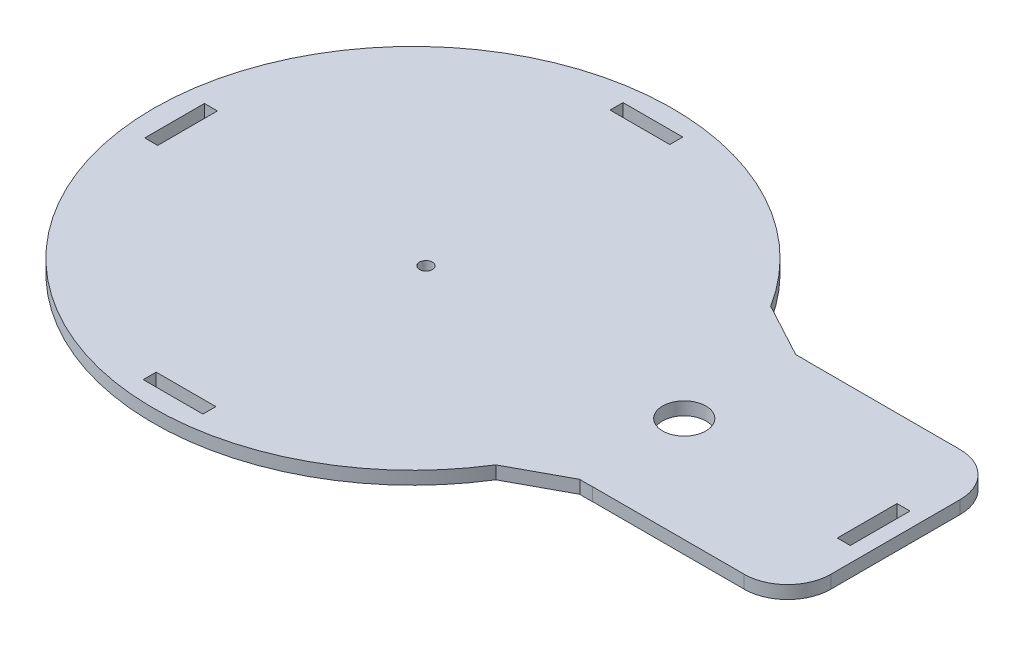
ISO-10303-21;
HEADER;
FILE_DESCRIPTION(('STEP AP214'),'2;1');
FILE_NAME('part.step','',(''),(''),'','','');
FILE_SCHEMA(('AUTOMOTIVE_DESIGN { 1 0 10303 214 1 1 1 1 }'));
ENDSEC;
DATA;
#1=APPLICATION_CONTEXT('core data for automotive mechanical design processes');
#2=APPLICATION_PROTOCOL_DEFINITION('international standard','automotive_design',2000,#1);
#3=PRODUCT_CONTEXT('',#1,'mechanical');
#4=PRODUCT('Part','Part','',(#3));
#5=PRODUCT_RELATED_PRODUCT_CATEGORY('part','',(#4));
#6=PRODUCT_DEFINITION_FORMATION('','',#4);
#7=PRODUCT_DEFINITION_CONTEXT('part definition',#1,'design');
#8=PRODUCT_DEFINITION('design','',#6,#7);
#9=PRODUCT_DEFINITION_SHAPE('','',#8);
#10=(LENGTH_UNIT() NAMED_UNIT(*) SI_UNIT(.MILLI.,.METRE.));
#11=(NAMED_UNIT(*) PLANE_ANGLE_UNIT() SI_UNIT($,.RADIAN.));
#12=(NAMED_UNIT(*) SI_UNIT($,.STERADIAN.) SOLID_ANGLE_UNIT());
#13=UNCERTAINTY_MEASURE_WITH_UNIT(LENGTH_MEASURE(1.E-05),#10,'distance_accuracy_value','');
#14=(GEOMETRIC_REPRESENTATION_CONTEXT(3) GLOBAL_UNCERTAINTY_ASSIGNED_CONTEXT((#13)) GLOBAL_UNIT_ASSIGNED_CONTEXT((#10,
#11,#12)) REPRESENTATION_CONTEXT('',''));
#15=CARTESIAN_POINT('',(0.,0.,0.));
#16=DIRECTION('',(0.,0.,1.));
#17=DIRECTION('',(1.,0.,0.));
#18=AXIS2_PLACEMENT_3D('',#15,#16,#17);
#19=CARTESIAN_POINT('',(65.,3.,0.));
#20=DIRECTION('',(0.,-1.,0.));
#21=DIRECTION('',(0.,0.,-1.));
#22=AXIS2_PLACEMENT_3D('',#19,#20,#21);
#23=CYLINDRICAL_SURFACE('',#22,25.);
#24=DIRECTION('',(0.,-1.,0.));
#25=VECTOR('',#24,1.);
#26=CARTESIAN_POINT('',(66.4785598802402,3.,-24.9562389129561));
#27=LINE('',#26,#25);
#28=CARTESIAN_POINT('',(66.4785598802402,0.,-24.9562389129561));
#29=VERTEX_POINT('',#28);
#30=CARTESIAN_POINT('',(66.4785598802402,3.,-24.9562389129561));
#31=VERTEX_POINT('',#30);
#32=EDGE_CURVE('E276',#29,#31,#27,.F.);
#33=ORIENTED_EDGE('',*,*,#32,.F.);
#34=CARTESIAN_POINT('',(65.,0.,0.));
#35=DIRECTION('',(0.,1.,0.));
#36=DIRECTION('',(0.,0.,1.));
#37=AXIS2_PLACEMENT_3D('',#34,#35,#36);
#38=CIRCLE('',#37,25.);
#39=CARTESIAN_POINT('',(63.5214401197598,0.,-24.9562389129561));
#40=VERTEX_POINT('',#39);
#41=EDGE_CURVE('E301',#29,#40,#38,.T.);
#42=ORIENTED_EDGE('',*,*,#41,.T.);
#43=DIRECTION('',(0.,-1.,0.));
#44=VECTOR('',#43,1.);
#45=CARTESIAN_POINT('',(63.5214401197598,3.,-24.9562389129561));
#46=LINE('',#45,#44);
#47=CARTESIAN_POINT('',(63.5214401197598,3.,-24.9562389129561));
#48=VERTEX_POINT('',#47);
#49=EDGE_CURVE('E404',#48,#40,#46,.T.);
#50=ORIENTED_EDGE('',*,*,#49,.F.);
#51=CARTESIAN_POINT('',(65.,3.,0.));
#52=DIRECTION('',(0.,1.,0.));
#53=DIRECTION('',(0.,0.,1.));
#54=AXIS2_PLACEMENT_3D('',#51,#52,#53);
#55=CIRCLE('',#54,25.);
#56=EDGE_CURVE('E370',#31,#48,#55,.T.);
#57=ORIENTED_EDGE('',*,*,#56,.F.);
#58=EDGE_LOOP('',(#33,#42,#50,#57));
#59=FACE_BOUND('',#58,.T.);
#60=ADVANCED_FACE('F40',(#59),#23,.T.);
#61=CARTESIAN_POINT('',(63.5214401197598,0.,24.9562389129561));
#62=VERTEX_POINT('',#61);
#63=CARTESIAN_POINT('',(66.4785598802402,0.,24.9562389129561));
#64=VERTEX_POINT('',#63);
#65=EDGE_CURVE('E380',#62,#64,#38,.T.);
#66=ORIENTED_EDGE('',*,*,#65,.T.);
#67=DIRECTION('',(0.,-1.,0.));
#68=VECTOR('',#67,1.);
#69=CARTESIAN_POINT('',(66.4785598802402,3.,24.9562389129561));
#70=LINE('',#69,#68);
#71=CARTESIAN_POINT('',(66.4785598802402,3.,24.9562389129561));
#72=VERTEX_POINT('',#71);
#73=EDGE_CURVE('E260',#64,#72,#70,.F.);
#74=ORIENTED_EDGE('',*,*,#73,.T.);
#75=CARTESIAN_POINT('',(63.5214401197598,3.,24.9562389129561));
#76=VERTEX_POINT('',#75);
#77=EDGE_CURVE('E365',#76,#72,#55,.T.);
#78=ORIENTED_EDGE('',*,*,#77,.F.);
#79=DIRECTION('',(0.,-1.,0.));
#80=VECTOR('',#79,1.);
#81=CARTESIAN_POINT('',(63.5214401197598,3.,24.9562389129561));
#82=LINE('',#81,#80);
#83=EDGE_CURVE('E379',#76,#62,#82,.T.);
#84=ORIENTED_EDGE('',*,*,#83,.T.);
#85=EDGE_LOOP('',(#66,#74,#78,#84));
#86=FACE_BOUND('',#85,.T.);
#87=ADVANCED_FACE('F530',(#86),#23,.T.);
#88=CARTESIAN_POINT('',(50.9013008311724,3.,-31.7656665866543));
#89=DIRECTION('',(-0.474854769411017,0.,0.880064172641751));
#90=DIRECTION('',(0.880064172641751,0.,0.474854769411017));
#91=AXIS2_PLACEMENT_3D('',#88,#89,#90);
#92=PLANE('',#91);
#93=DIRECTION('',(-0.880064172641751,0.,-0.474854769411017));
#94=VECTOR('',#93,1.);
#95=CARTESIAN_POINT('',(50.9013008311724,0.,-31.7656665866543));
#96=LINE('',#95,#94);
#97=CARTESIAN_POINT('',(50.9013008311724,0.,-31.7656665866543));
#98=VERTEX_POINT('',#97);
#99=EDGE_CURVE('E384',#40,#98,#96,.T.);
#100=ORIENTED_EDGE('',*,*,#99,.T.);
#101=DIRECTION('',(0.,-1.,0.));
#102=VECTOR('',#101,1.);
#103=CARTESIAN_POINT('',(50.9013008311724,3.,-31.7656665866543));
#104=LINE('',#103,#102);
#105=CARTESIAN_POINT('',(50.9013008311724,3.,-31.7656665866543));
#106=VERTEX_POINT('',#105);
#107=EDGE_CURVE('E400',#106,#98,#104,.T.);
#108=ORIENTED_EDGE('',*,*,#107,.F.);
#109=DIRECTION('',(-0.880064172641751,0.,-0.474854769411017));
#110=VECTOR('',#109,1.);
#111=CARTESIAN_POINT('',(50.9013008311724,3.,-31.7656665866543));
#112=LINE('',#111,#110);
#113=EDGE_CURVE('E369',#48,#106,#112,.T.);
#114=ORIENTED_EDGE('',*,*,#113,.F.);
#115=ORIENTED_EDGE('',*,*,#49,.T.);
#116=EDGE_LOOP('',(#100,#108,#114,#115));
#117=FACE_BOUND('',#116,.T.);
#118=ADVANCED_FACE('F536',(#117),#92,.F.);
#119=CARTESIAN_POINT('',(0.,3.,0.));
#120=DIRECTION('',(0.,-1.,0.));
#121=DIRECTION('',(0.,0.,-1.));
#122=AXIS2_PLACEMENT_3D('',#119,#120,#121);
#123=CYLINDRICAL_SURFACE('',#122,60.);
#124=CARTESIAN_POINT('',(0.,0.,0.));
#125=DIRECTION('',(0.,1.,0.));
#126=DIRECTION('',(0.,0.,1.));
#127=AXIS2_PLACEMENT_3D('',#124,#125,#126);
#128=CIRCLE('',#127,60.);
#129=CARTESIAN_POINT('',(50.9013008311724,0.,31.7656665866543));
#130=VERTEX_POINT('',#129);
#131=EDGE_CURVE('E387',#98,#130,#128,.T.);
#132=ORIENTED_EDGE('',*,*,#131,.T.);
#133=DIRECTION('',(0.,-1.,0.));
#134=VECTOR('',#133,1.);
#135=CARTESIAN_POINT('',(50.9013008311724,3.,31.7656665866543));
#136=LINE('',#135,#134);
#137=CARTESIAN_POINT('',(50.9013008311724,3.,31.7656665866543));
#138=VERTEX_POINT('',#137);
#139=EDGE_CURVE('E396',#138,#130,#136,.T.);
#140=ORIENTED_EDGE('',*,*,#139,.F.);
#141=CARTESIAN_POINT('',(0.,3.,0.));
#142=DIRECTION('',(0.,1.,0.));
#143=DIRECTION('',(0.,0.,1.));
#144=AXIS2_PLACEMENT_3D('',#141,#142,#143);
#145=CIRCLE('',#144,60.);
#146=EDGE_CURVE('E373',#106,#138,#145,.T.);
#147=ORIENTED_EDGE('',*,*,#146,.F.);
#148=ORIENTED_EDGE('',*,*,#107,.T.);
#149=EDGE_LOOP('',(#132,#140,#147,#148));
#150=FACE_BOUND('',#149,.T.);
#151=ADVANCED_FACE('F525',(#150),#123,.T.);
#152=CARTESIAN_POINT('',(50.9013008311724,3.,31.7656665866543));
#153=DIRECTION('',(-0.474854769411017,0.,-0.880064172641751));
#154=DIRECTION('',(-0.880064172641751,0.,0.474854769411017));
#155=AXIS2_PLACEMENT_3D('',#152,#153,#154);
#156=PLANE('',#155);
#157=DIRECTION('',(0.880064172641751,0.,-0.474854769411017));
#158=VECTOR('',#157,1.);
#159=CARTESIAN_POINT('',(50.9013008311724,0.,31.7656665866543));
#160=LINE('',#159,#158);
#161=EDGE_CURVE('E390',#130,#62,#160,.T.);
#162=ORIENTED_EDGE('',*,*,#161,.T.);
#163=ORIENTED_EDGE('',*,*,#83,.F.);
#164=DIRECTION('',(0.880064172641751,0.,-0.474854769411017));
#165=VECTOR('',#164,1.);
#166=CARTESIAN_POINT('',(50.9013008311724,3.,31.7656665866543));
#167=LINE('',#166,#165);
#168=EDGE_CURVE('E376',#138,#76,#167,.T.);
#169=ORIENTED_EDGE('',*,*,#168,.F.);
#170=ORIENTED_EDGE('',*,*,#139,.T.);
#171=EDGE_LOOP('',(#162,#163,#169,#170));
#172=FACE_BOUND('',#171,.T.);
#173=ADVANCED_FACE('F515',(#172),#156,.F.);
#174=CARTESIAN_POINT('',(65.,3.,0.));
#175=DIRECTION('',(0.,1.,0.));
#176=DIRECTION('',(0.,0.,1.));
#177=AXIS2_PLACEMENT_3D('',#174,#175,#176);
#178=PLANE('',#177);
#179=CARTESIAN_POINT('',(63.4014401197598,3.,0.703761087043913));
#180=DIRECTION('',(0.,1.,0.));
#181=DIRECTION('',(0.,0.,1.));
#182=AXIS2_PLACEMENT_3D('',#179,#180,#181);
#183=CIRCLE('',#182,5.);
#184=CARTESIAN_POINT('',(63.4014401197598,3.,5.70376108704392));
#185=VERTEX_POINT('',#184);
#186=EDGE_CURVE('E503',#185,#185,#183,.T.);
#187=ORIENTED_EDGE('',*,*,#186,.F.);
#188=EDGE_LOOP('',(#187));
#189=FACE_BOUND('',#188,.T.);
#190=CARTESIAN_POINT('',(3.,3.,0.));
#191=DIRECTION('',(0.,1.,0.));
#192=DIRECTION('',(0.,0.,1.));
#193=AXIS2_PLACEMENT_3D('',#190,#191,#192);
#194=CIRCLE('',#193,1.5);
#195=CARTESIAN_POINT('',(3.,3.,1.5));
#196=VERTEX_POINT('',#195);
#197=EDGE_CURVE('E492',#196,#196,#194,.T.);
#198=ORIENTED_EDGE('',*,*,#197,.F.);
#199=EDGE_LOOP('',(#198));
#200=FACE_BOUND('',#199,.T.);
#201=DIRECTION('',(0.,0.,1.));
#202=VECTOR('',#201,1.);
#203=CARTESIAN_POINT('',(105.02144011976,3.,6.94376108704392));
#204=LINE('',#203,#202);
#205=CARTESIAN_POINT('',(105.02144011976,3.,-6.85623891295609));
#206=VERTEX_POINT('',#205);
#207=CARTESIAN_POINT('',(105.02144011976,3.,6.94376108704392));
#208=VERTEX_POINT('',#207);
#209=EDGE_CURVE('E58',#206,#208,#204,.T.);
#210=ORIENTED_EDGE('',*,*,#209,.F.);
#211=DIRECTION('',(-1.,0.,0.));
#212=VECTOR('',#211,1.);
#213=CARTESIAN_POINT('',(108.02144011976,3.,-6.85623891295609));
#214=LINE('',#213,#212);
#215=CARTESIAN_POINT('',(108.02144011976,3.,-6.85623891295609));
#216=VERTEX_POINT('',#215);
#217=EDGE_CURVE('E237',#216,#206,#214,.T.);
#218=ORIENTED_EDGE('',*,*,#217,.F.);
#219=DIRECTION('',(0.,0.,-1.));
#220=VECTOR('',#219,1.);
#221=CARTESIAN_POINT('',(108.02144011976,3.,6.94376108704391));
#222=LINE('',#221,#220);
#223=CARTESIAN_POINT('',(108.02144011976,3.,6.94376108704391));
#224=VERTEX_POINT('',#223);
#225=EDGE_CURVE('E219',#224,#216,#222,.T.);
#226=ORIENTED_EDGE('',*,*,#225,.F.);
#227=DIRECTION('',(1.,0.,0.));
#228=VECTOR('',#227,1.);
#229=CARTESIAN_POINT('',(108.02144011976,3.,6.94376108704391));
#230=LINE('',#229,#228);
#231=EDGE_CURVE('E229',#208,#224,#230,.T.);
#232=ORIENTED_EDGE('',*,*,#231,.F.);
#233=EDGE_LOOP('',(#210,#218,#226,#232));
#234=FACE_BOUND('',#233,.T.);
#235=DIRECTION('',(0.,0.,1.));
#236=VECTOR('',#235,1.);
#237=CARTESIAN_POINT('',(111.52144011976,3.,0.));
#238=LINE('',#237,#236);
#239=CARTESIAN_POINT('',(111.52144011976,3.,-14.9562389129561));
#240=VERTEX_POINT('',#239);
#241=CARTESIAN_POINT('',(111.52144011976,3.,14.9562389129561));
#242=VERTEX_POINT('',#241);
#243=EDGE_CURVE('E247',#240,#242,#238,.T.);
#244=ORIENTED_EDGE('',*,*,#243,.F.);
#245=CARTESIAN_POINT('',(101.52144011976,3.,-14.9562389129561));
#246=DIRECTION('',(0.,1.,0.));
#247=DIRECTION('',(0.,0.,1.));
#248=AXIS2_PLACEMENT_3D('',#245,#246,#247);
#249=CIRCLE('',#248,10.);
#250=CARTESIAN_POINT('',(101.52144011976,3.,-24.9562389129561));
#251=VERTEX_POINT('',#250);
#252=EDGE_CURVE('E466',#240,#251,#249,.T.);
#253=ORIENTED_EDGE('',*,*,#252,.T.);
#254=DIRECTION('',(1.,0.,0.));
#255=VECTOR('',#254,1.);
#256=CARTESIAN_POINT('',(0.,3.,-24.9562389129561));
#257=LINE('',#256,#255);
#258=EDGE_CURVE('E264',#31,#251,#257,.T.);
#259=ORIENTED_EDGE('',*,*,#258,.F.);
#260=ORIENTED_EDGE('',*,*,#56,.T.);
#261=ORIENTED_EDGE('',*,*,#113,.T.);
#262=ORIENTED_EDGE('',*,*,#146,.T.);
#263=ORIENTED_EDGE('',*,*,#168,.T.);
#264=ORIENTED_EDGE('',*,*,#77,.T.);
#265=DIRECTION('',(1.,0.,0.));
#266=VECTOR('',#265,1.);
#267=CARTESIAN_POINT('',(0.,3.,24.9562389129561));
#268=LINE('',#267,#266);
#269=CARTESIAN_POINT('',(101.52144011976,3.,24.9562389129561));
#270=VERTEX_POINT('',#269);
#271=EDGE_CURVE('E268',#72,#270,#268,.T.);
#272=ORIENTED_EDGE('',*,*,#271,.T.);
#273=CARTESIAN_POINT('',(101.52144011976,3.,14.9562389129561));
#274=DIRECTION('',(0.,1.,0.));
#275=DIRECTION('',(0.,0.,1.));
#276=AXIS2_PLACEMENT_3D('',#273,#274,#275);
#277=CIRCLE('',#276,10.);
#278=EDGE_CURVE('E463',#270,#242,#277,.T.);
#279=ORIENTED_EDGE('',*,*,#278,.T.);
#280=EDGE_LOOP('',(#244,#253,#259,#260,#261,#262,#263,#264,#272,#279));
#281=FACE_BOUND('',#280,.T.);
#282=DIRECTION('',(0.,0.,-1.));
#283=VECTOR('',#282,1.);
#284=CARTESIAN_POINT('',(6.9,3.,55.4568517539151));
#285=LINE('',#284,#283);
#286=CARTESIAN_POINT('',(6.9,3.,55.4568517539151));
#287=VERTEX_POINT('',#286);
#288=CARTESIAN_POINT('',(6.9,3.,52.4568517539151));
#289=VERTEX_POINT('',#288);
#290=EDGE_CURVE('E281',#287,#289,#285,.T.);
#291=ORIENTED_EDGE('',*,*,#290,.F.);
#292=DIRECTION('',(1.,0.,0.));
#293=VECTOR('',#292,1.);
#294=CARTESIAN_POINT('',(-6.9,3.,55.4568517539151));
#295=LINE('',#294,#293);
#296=CARTESIAN_POINT('',(-6.9,3.,55.4568517539151));
#297=VERTEX_POINT('',#296);
#298=EDGE_CURVE('E293',#297,#287,#295,.T.);
#299=ORIENTED_EDGE('',*,*,#298,.F.);
#300=DIRECTION('',(0.,0.,1.));
#301=VECTOR('',#300,1.);
#302=CARTESIAN_POINT('',(-6.9,3.,55.4568517539151));
#303=LINE('',#302,#301);
#304=CARTESIAN_POINT('',(-6.9,3.,52.4568517539151));
#305=VERTEX_POINT('',#304);
#306=EDGE_CURVE('E289',#305,#297,#303,.T.);
#307=ORIENTED_EDGE('',*,*,#306,.F.);
#308=DIRECTION('',(-1.,0.,0.));
#309=VECTOR('',#308,1.);
#310=CARTESIAN_POINT('',(-6.9,3.,52.4568517539151));
#311=LINE('',#310,#309);
#312=EDGE_CURVE('E284',#289,#305,#311,.T.);
#313=ORIENTED_EDGE('',*,*,#312,.F.);
#314=EDGE_LOOP('',(#291,#299,#307,#313));
#315=FACE_BOUND('',#314,.T.);
#316=DIRECTION('',(0.,0.,-1.));
#317=VECTOR('',#316,1.);
#318=CARTESIAN_POINT('',(-52.1052277201253,3.,6.9));
#319=LINE('',#318,#317);
#320=CARTESIAN_POINT('',(-52.1052277201253,3.,6.9));
#321=VERTEX_POINT('',#320);
#322=CARTESIAN_POINT('',(-52.1052277201253,3.,-6.9));
#323=VERTEX_POINT('',#322);
#324=EDGE_CURVE('E311',#321,#323,#319,.T.);
#325=ORIENTED_EDGE('',*,*,#324,.F.);
#326=DIRECTION('',(1.,0.,0.));
#327=VECTOR('',#326,1.);
#328=CARTESIAN_POINT('',(-55.1052277201253,3.,6.9));
#329=LINE('',#328,#327);
#330=CARTESIAN_POINT('',(-55.1052277201253,3.,6.9));
#331=VERTEX_POINT('',#330);
#332=EDGE_CURVE('E323',#331,#321,#329,.T.);
#333=ORIENTED_EDGE('',*,*,#332,.F.);
#334=DIRECTION('',(0.,0.,1.));
#335=VECTOR('',#334,1.);
#336=CARTESIAN_POINT('',(-55.1052277201253,3.,6.9));
#337=LINE('',#336,#335);
#338=CARTESIAN_POINT('',(-55.1052277201253,3.,-6.9));
#339=VERTEX_POINT('',#338);
#340=EDGE_CURVE('E319',#339,#331,#337,.T.);
#341=ORIENTED_EDGE('',*,*,#340,.F.);
#342=DIRECTION('',(-1.,0.,0.));
#343=VECTOR('',#342,1.);
#344=CARTESIAN_POINT('',(-55.1052277201253,3.,-6.9));
#345=LINE('',#344,#343);
#346=EDGE_CURVE('E314',#323,#339,#345,.T.);
#347=ORIENTED_EDGE('',*,*,#346,.F.);
#348=EDGE_LOOP('',(#325,#333,#341,#347));
#349=FACE_BOUND('',#348,.T.);
#350=DIRECTION('',(0.,0.,1.));
#351=VECTOR('',#350,1.);
#352=CARTESIAN_POINT('',(-6.9,3.,-55.4568517539151));
#353=LINE('',#352,#351);
#354=CARTESIAN_POINT('',(-6.9,3.,-55.4568517539151));
#355=VERTEX_POINT('',#354);
#356=CARTESIAN_POINT('',(-6.9,3.,-52.4568517539151));
#357=VERTEX_POINT('',#356);
#358=EDGE_CURVE('E280',#355,#357,#353,.T.);
#359=ORIENTED_EDGE('',*,*,#358,.F.);
#360=DIRECTION('',(-1.,0.,0.));
#361=VECTOR('',#360,1.);
#362=CARTESIAN_POINT('',(-6.9,3.,-55.4568517539151));
#363=LINE('',#362,#361);
#364=CARTESIAN_POINT('',(6.9,3.,-55.4568517539151));
#365=VERTEX_POINT('',#364);
#366=EDGE_CURVE('E349',#365,#355,#363,.T.);
#367=ORIENTED_EDGE('',*,*,#366,.F.);
#368=DIRECTION('',(0.,0.,-1.));
#369=VECTOR('',#368,1.);
#370=CARTESIAN_POINT('',(6.9,3.,-55.4568517539151));
#371=LINE('',#370,#369);
#372=CARTESIAN_POINT('',(6.9,3.,-52.4568517539151));
#373=VERTEX_POINT('',#372);
#374=EDGE_CURVE('E345',#373,#365,#371,.T.);
#375=ORIENTED_EDGE('',*,*,#374,.F.);
#376=DIRECTION('',(1.,0.,0.));
#377=VECTOR('',#376,1.);
#378=CARTESIAN_POINT('',(-6.9,3.,-52.4568517539151));
#379=LINE('',#378,#377);
#380=EDGE_CURVE('E341',#357,#373,#379,.T.);
#381=ORIENTED_EDGE('',*,*,#380,.F.);
#382=EDGE_LOOP('',(#359,#367,#375,#381));
#383=FACE_BOUND('',#382,.T.);
#384=ADVANCED_FACE('F234',(#189,#200,#234,#281,#315,#349,#383),#178,.T.);
#385=CARTESIAN_POINT('',(65.,0.,0.));
#386=DIRECTION('',(0.,1.,0.));
#387=DIRECTION('',(0.,0.,1.));
#388=AXIS2_PLACEMENT_3D('',#385,#386,#387);
#389=PLANE('',#388);
#390=CARTESIAN_POINT('',(63.4014401197598,0.,0.703761087043913));
#391=DIRECTION('',(0.,1.,0.));
#392=DIRECTION('',(0.,0.,1.));
#393=AXIS2_PLACEMENT_3D('',#390,#391,#392);
#394=CIRCLE('',#393,5.);
#395=CARTESIAN_POINT('',(63.4014401197598,0.,5.70376108704392));
#396=VERTEX_POINT('',#395);
#397=EDGE_CURVE('E44',#396,#396,#394,.T.);
#398=ORIENTED_EDGE('',*,*,#397,.T.);
#399=EDGE_LOOP('',(#398));
#400=FACE_BOUND('',#399,.T.);
#401=CARTESIAN_POINT('',(3.,0.,0.));
#402=DIRECTION('',(0.,1.,0.));
#403=DIRECTION('',(0.,0.,1.));
#404=AXIS2_PLACEMENT_3D('',#401,#402,#403);
#405=CIRCLE('',#404,1.5);
#406=CARTESIAN_POINT('',(3.,0.,1.5));
#407=VERTEX_POINT('',#406);
#408=EDGE_CURVE('E489',#407,#407,#405,.T.);
#409=ORIENTED_EDGE('',*,*,#408,.T.);
#410=EDGE_LOOP('',(#409));
#411=FACE_BOUND('',#410,.T.);
#412=DIRECTION('',(-1.,0.,0.));
#413=VECTOR('',#412,1.);
#414=CARTESIAN_POINT('',(65.,0.,-6.85623891295609));
#415=LINE('',#414,#413);
#416=CARTESIAN_POINT('',(108.02144011976,0.,-6.85623891295609));
#417=VERTEX_POINT('',#416);
#418=CARTESIAN_POINT('',(105.02144011976,0.,-6.85623891295609));
#419=VERTEX_POINT('',#418);
#420=EDGE_CURVE('E50',#417,#419,#415,.T.);
#421=ORIENTED_EDGE('',*,*,#420,.T.);
#422=DIRECTION('',(0.,0.,1.));
#423=VECTOR('',#422,1.);
#424=CARTESIAN_POINT('',(105.02144011976,0.,0.));
#425=LINE('',#424,#423);
#426=CARTESIAN_POINT('',(105.02144011976,0.,6.94376108704392));
#427=VERTEX_POINT('',#426);
#428=EDGE_CURVE('E11',#419,#427,#425,.T.);
#429=ORIENTED_EDGE('',*,*,#428,.T.);
#430=DIRECTION('',(1.,0.,0.));
#431=VECTOR('',#430,1.);
#432=CARTESIAN_POINT('',(65.,0.,6.94376108704393));
#433=LINE('',#432,#431);
#434=CARTESIAN_POINT('',(108.02144011976,0.,6.94376108704391));
#435=VERTEX_POINT('',#434);
#436=EDGE_CURVE('E482',#427,#435,#433,.T.);
#437=ORIENTED_EDGE('',*,*,#436,.T.);
#438=DIRECTION('',(0.,0.,-1.));
#439=VECTOR('',#438,1.);
#440=CARTESIAN_POINT('',(108.02144011976,0.,0.));
#441=LINE('',#440,#439);
#442=EDGE_CURVE('E222',#435,#417,#441,.T.);
#443=ORIENTED_EDGE('',*,*,#442,.T.);
#444=EDGE_LOOP('',(#421,#429,#437,#443));
#445=FACE_BOUND('',#444,.T.);
#446=DIRECTION('',(-1.,0.,0.));
#447=VECTOR('',#446,1.);
#448=CARTESIAN_POINT('',(0.,0.,-24.9562389129561));
#449=LINE('',#448,#447);
#450=CARTESIAN_POINT('',(101.52144011976,0.,-24.9562389129561));
#451=VERTEX_POINT('',#450);
#452=EDGE_CURVE('E256',#451,#29,#449,.T.);
#453=ORIENTED_EDGE('',*,*,#452,.F.);
#454=CARTESIAN_POINT('',(101.52144011976,0.,-14.9562389129561));
#455=DIRECTION('',(0.,1.,0.));
#456=DIRECTION('',(0.,0.,1.));
#457=AXIS2_PLACEMENT_3D('',#454,#455,#456);
#458=CIRCLE('',#457,10.);
#459=CARTESIAN_POINT('',(111.52144011976,0.,-14.9562389129561));
#460=VERTEX_POINT('',#459);
#461=EDGE_CURVE('E475',#451,#460,#458,.F.);
#462=ORIENTED_EDGE('',*,*,#461,.T.);
#463=DIRECTION('',(0.,0.,-1.));
#464=VECTOR('',#463,1.);
#465=CARTESIAN_POINT('',(111.52144011976,0.,0.));
#466=LINE('',#465,#464);
#467=CARTESIAN_POINT('',(111.52144011976,0.,14.9562389129561));
#468=VERTEX_POINT('',#467);
#469=EDGE_CURVE('E255',#468,#460,#466,.T.);
#470=ORIENTED_EDGE('',*,*,#469,.F.);
#471=CARTESIAN_POINT('',(101.52144011976,0.,14.9562389129561));
#472=DIRECTION('',(0.,1.,0.));
#473=DIRECTION('',(0.,0.,1.));
#474=AXIS2_PLACEMENT_3D('',#471,#472,#473);
#475=CIRCLE('',#474,10.);
#476=CARTESIAN_POINT('',(101.52144011976,0.,24.9562389129561));
#477=VERTEX_POINT('',#476);
#478=EDGE_CURVE('E472',#468,#477,#475,.F.);
#479=ORIENTED_EDGE('',*,*,#478,.T.);
#480=DIRECTION('',(-1.,0.,0.));
#481=VECTOR('',#480,1.);
#482=CARTESIAN_POINT('',(0.,0.,24.9562389129561));
#483=LINE('',#482,#481);
#484=EDGE_CURVE('E252',#477,#64,#483,.T.);
#485=ORIENTED_EDGE('',*,*,#484,.T.);
#486=ORIENTED_EDGE('',*,*,#65,.F.);
#487=ORIENTED_EDGE('',*,*,#161,.F.);
#488=ORIENTED_EDGE('',*,*,#131,.F.);
#489=ORIENTED_EDGE('',*,*,#99,.F.);
#490=ORIENTED_EDGE('',*,*,#41,.F.);
#491=EDGE_LOOP('',(#453,#462,#470,#479,#485,#486,#487,#488,#489,#490));
#492=FACE_BOUND('',#491,.T.);
#493=DIRECTION('',(-1.,0.,0.));
#494=VECTOR('',#493,1.);
#495=CARTESIAN_POINT('',(65.,0.,-55.4568517539151));
#496=LINE('',#495,#494);
#497=CARTESIAN_POINT('',(6.9,0.,-55.4568517539151));
#498=VERTEX_POINT('',#497);
#499=CARTESIAN_POINT('',(-6.9,0.,-55.4568517539151));
#500=VERTEX_POINT('',#499);
#501=EDGE_CURVE('E416',#498,#500,#496,.T.);
#502=ORIENTED_EDGE('',*,*,#501,.T.);
#503=DIRECTION('',(0.,0.,1.));
#504=VECTOR('',#503,1.);
#505=CARTESIAN_POINT('',(-6.90000000000003,0.,0.));
#506=LINE('',#505,#504);
#507=CARTESIAN_POINT('',(-6.9,0.,-52.4568517539151));
#508=VERTEX_POINT('',#507);
#509=EDGE_CURVE('E420',#500,#508,#506,.T.);
#510=ORIENTED_EDGE('',*,*,#509,.T.);
#511=DIRECTION('',(1.,0.,0.));
#512=VECTOR('',#511,1.);
#513=CARTESIAN_POINT('',(65.,0.,-52.4568517539151));
#514=LINE('',#513,#512);
#515=CARTESIAN_POINT('',(6.9,0.,-52.4568517539151));
#516=VERTEX_POINT('',#515);
#517=EDGE_CURVE('E408',#508,#516,#514,.T.);
#518=ORIENTED_EDGE('',*,*,#517,.T.);
#519=DIRECTION('',(0.,0.,-1.));
#520=VECTOR('',#519,1.);
#521=CARTESIAN_POINT('',(6.9,0.,0.));
#522=LINE('',#521,#520);
#523=EDGE_CURVE('E412',#516,#498,#522,.T.);
#524=ORIENTED_EDGE('',*,*,#523,.T.);
#525=EDGE_LOOP('',(#502,#510,#518,#524));
#526=FACE_BOUND('',#525,.T.);
#527=DIRECTION('',(1.,0.,0.));
#528=VECTOR('',#527,1.);
#529=CARTESIAN_POINT('',(65.,0.,6.9));
#530=LINE('',#529,#528);
#531=CARTESIAN_POINT('',(-55.1052277201253,0.,6.9));
#532=VERTEX_POINT('',#531);
#533=CARTESIAN_POINT('',(-52.1052277201253,0.,6.9));
#534=VERTEX_POINT('',#533);
#535=EDGE_CURVE('E432',#532,#534,#530,.T.);
#536=ORIENTED_EDGE('',*,*,#535,.T.);
#537=DIRECTION('',(0.,0.,-1.));
#538=VECTOR('',#537,1.);
#539=CARTESIAN_POINT('',(-52.1052277201253,0.,0.));
#540=LINE('',#539,#538);
#541=CARTESIAN_POINT('',(-52.1052277201253,0.,-6.9));
#542=VERTEX_POINT('',#541);
#543=EDGE_CURVE('E436',#534,#542,#540,.T.);
#544=ORIENTED_EDGE('',*,*,#543,.T.);
#545=DIRECTION('',(-1.,0.,0.));
#546=VECTOR('',#545,1.);
#547=CARTESIAN_POINT('',(65.,0.,-6.9));
#548=LINE('',#547,#546);
#549=CARTESIAN_POINT('',(-55.1052277201253,0.,-6.9));
#550=VERTEX_POINT('',#549);
#551=EDGE_CURVE('E424',#542,#550,#548,.T.);
#552=ORIENTED_EDGE('',*,*,#551,.T.);
#553=DIRECTION('',(0.,0.,1.));
#554=VECTOR('',#553,1.);
#555=CARTESIAN_POINT('',(-55.1052277201253,0.,0.));
#556=LINE('',#555,#554);
#557=EDGE_CURVE('E428',#550,#532,#556,.T.);
#558=ORIENTED_EDGE('',*,*,#557,.T.);
#559=EDGE_LOOP('',(#536,#544,#552,#558));
#560=FACE_BOUND('',#559,.T.);
#561=DIRECTION('',(1.,0.,0.));
#562=VECTOR('',#561,1.);
#563=CARTESIAN_POINT('',(65.,0.,55.4568517539151));
#564=LINE('',#563,#562);
#565=CARTESIAN_POINT('',(-6.9,0.,55.4568517539151));
#566=VERTEX_POINT('',#565);
#567=CARTESIAN_POINT('',(6.9,0.,55.4568517539151));
#568=VERTEX_POINT('',#567);
#569=EDGE_CURVE('E448',#566,#568,#564,.T.);
#570=ORIENTED_EDGE('',*,*,#569,.T.);
#571=DIRECTION('',(0.,0.,-1.));
#572=VECTOR('',#571,1.);
#573=CARTESIAN_POINT('',(6.9,0.,0.));
#574=LINE('',#573,#572);
#575=CARTESIAN_POINT('',(6.9,0.,52.4568517539151));
#576=VERTEX_POINT('',#575);
#577=EDGE_CURVE('E452',#568,#576,#574,.T.);
#578=ORIENTED_EDGE('',*,*,#577,.T.);
#579=DIRECTION('',(-1.,0.,0.));
#580=VECTOR('',#579,1.);
#581=CARTESIAN_POINT('',(65.,0.,52.4568517539151));
#582=LINE('',#581,#580);
#583=CARTESIAN_POINT('',(-6.9,0.,52.4568517539151));
#584=VERTEX_POINT('',#583);
#585=EDGE_CURVE('E440',#576,#584,#582,.T.);
#586=ORIENTED_EDGE('',*,*,#585,.T.);
#587=DIRECTION('',(0.,0.,1.));
#588=VECTOR('',#587,1.);
#589=CARTESIAN_POINT('',(-6.90000000000003,0.,0.));
#590=LINE('',#589,#588);
#591=EDGE_CURVE('E444',#584,#566,#590,.T.);
#592=ORIENTED_EDGE('',*,*,#591,.T.);
#593=EDGE_LOOP('',(#570,#578,#586,#592));
#594=FACE_BOUND('',#593,.T.);
#595=ADVANCED_FACE('F514',(#400,#411,#445,#492,#526,#560,#594),#389,.F.);
#596=CARTESIAN_POINT('',(-6.9,-7.,-55.4568517539151));
#597=DIRECTION('',(-1.,0.,0.));
#598=DIRECTION('',(0.,0.,1.));
#599=AXIS2_PLACEMENT_3D('',#596,#597,#598);
#600=PLANE('',#599);
#601=DIRECTION('',(0.,1.,0.));
#602=VECTOR('',#601,1.);
#603=CARTESIAN_POINT('',(-6.9,-7.,-55.4568517539151));
#604=LINE('',#603,#602);
#605=EDGE_CURVE('E315',#500,#355,#604,.T.);
#606=ORIENTED_EDGE('',*,*,#605,.T.);
#607=ORIENTED_EDGE('',*,*,#358,.T.);
#608=DIRECTION('',(0.,1.,0.));
#609=VECTOR('',#608,1.);
#610=CARTESIAN_POINT('',(-6.9,-7.,-52.4568517539151));
#611=LINE('',#610,#609);
#612=EDGE_CURVE('E353',#508,#357,#611,.T.);
#613=ORIENTED_EDGE('',*,*,#612,.F.);
#614=ORIENTED_EDGE('',*,*,#509,.F.);
#615=EDGE_LOOP('',(#606,#607,#613,#614));
#616=FACE_BOUND('',#615,.T.);
#617=ADVANCED_FACE('F521',(#616),#600,.F.);
#618=CARTESIAN_POINT('',(-6.9,-7.,-55.4568517539151));
#619=DIRECTION('',(0.,0.,-1.));
#620=DIRECTION('',(-1.,0.,0.));
#621=AXIS2_PLACEMENT_3D('',#618,#619,#620);
#622=PLANE('',#621);
#623=DIRECTION('',(0.,1.,0.));
#624=VECTOR('',#623,1.);
#625=CARTESIAN_POINT('',(6.9,-7.,-55.4568517539151));
#626=LINE('',#625,#624);
#627=EDGE_CURVE('E356',#498,#365,#626,.T.);
#628=ORIENTED_EDGE('',*,*,#627,.T.);
#629=ORIENTED_EDGE('',*,*,#366,.T.);
#630=ORIENTED_EDGE('',*,*,#605,.F.);
#631=ORIENTED_EDGE('',*,*,#501,.F.);
#632=EDGE_LOOP('',(#628,#629,#630,#631));
#633=FACE_BOUND('',#632,.T.);
#634=ADVANCED_FACE('F631',(#633),#622,.F.);
#635=CARTESIAN_POINT('',(6.9,-7.,-55.4568517539151));
#636=DIRECTION('',(1.,0.,0.));
#637=DIRECTION('',(0.,0.,-1.));
#638=AXIS2_PLACEMENT_3D('',#635,#636,#637);
#639=PLANE('',#638);
#640=DIRECTION('',(0.,1.,0.));
#641=VECTOR('',#640,1.);
#642=CARTESIAN_POINT('',(6.9,-7.,-52.4568517539151));
#643=LINE('',#642,#641);
#644=EDGE_CURVE('E359',#516,#373,#643,.T.);
#645=ORIENTED_EDGE('',*,*,#644,.T.);
#646=ORIENTED_EDGE('',*,*,#374,.T.);
#647=ORIENTED_EDGE('',*,*,#627,.F.);
#648=ORIENTED_EDGE('',*,*,#523,.F.);
#649=EDGE_LOOP('',(#645,#646,#647,#648));
#650=FACE_BOUND('',#649,.T.);
#651=ADVANCED_FACE('F634',(#650),#639,.F.);
#652=CARTESIAN_POINT('',(-6.9,-7.,-52.4568517539151));
#653=DIRECTION('',(0.,0.,1.));
#654=DIRECTION('',(1.,0.,0.));
#655=AXIS2_PLACEMENT_3D('',#652,#653,#654);
#656=PLANE('',#655);
#657=ORIENTED_EDGE('',*,*,#612,.T.);
#658=ORIENTED_EDGE('',*,*,#380,.T.);
#659=ORIENTED_EDGE('',*,*,#644,.F.);
#660=ORIENTED_EDGE('',*,*,#517,.F.);
#661=EDGE_LOOP('',(#657,#658,#659,#660));
#662=FACE_BOUND('',#661,.T.);
#663=ADVANCED_FACE('F629',(#662),#656,.F.);
#664=CARTESIAN_POINT('',(-52.1052277201253,-7.,6.9));
#665=DIRECTION('',(1.,0.,0.));
#666=DIRECTION('',(0.,0.,-1.));
#667=AXIS2_PLACEMENT_3D('',#664,#665,#666);
#668=PLANE('',#667);
#669=DIRECTION('',(0.,1.,0.));
#670=VECTOR('',#669,1.);
#671=CARTESIAN_POINT('',(-52.1052277201253,-7.,6.9));
#672=LINE('',#671,#670);
#673=EDGE_CURVE('E285',#534,#321,#672,.T.);
#674=ORIENTED_EDGE('',*,*,#673,.T.);
#675=ORIENTED_EDGE('',*,*,#324,.T.);
#676=DIRECTION('',(0.,1.,0.));
#677=VECTOR('',#676,1.);
#678=CARTESIAN_POINT('',(-52.1052277201253,-7.,-6.9));
#679=LINE('',#678,#677);
#680=EDGE_CURVE('E327',#542,#323,#679,.T.);
#681=ORIENTED_EDGE('',*,*,#680,.F.);
#682=ORIENTED_EDGE('',*,*,#543,.F.);
#683=EDGE_LOOP('',(#674,#675,#681,#682));
#684=FACE_BOUND('',#683,.T.);
#685=ADVANCED_FACE('F619',(#684),#668,.F.);
#686=CARTESIAN_POINT('',(-55.1052277201253,-7.,6.9));
#687=DIRECTION('',(0.,0.,1.));
#688=DIRECTION('',(1.,0.,0.));
#689=AXIS2_PLACEMENT_3D('',#686,#687,#688);
#690=PLANE('',#689);
#691=DIRECTION('',(0.,1.,0.));
#692=VECTOR('',#691,1.);
#693=CARTESIAN_POINT('',(-55.1052277201253,-7.,6.9));
#694=LINE('',#693,#692);
#695=EDGE_CURVE('E330',#532,#331,#694,.T.);
#696=ORIENTED_EDGE('',*,*,#695,.T.);
#697=ORIENTED_EDGE('',*,*,#332,.T.);
#698=ORIENTED_EDGE('',*,*,#673,.F.);
#699=ORIENTED_EDGE('',*,*,#535,.F.);
#700=EDGE_LOOP('',(#696,#697,#698,#699));
#701=FACE_BOUND('',#700,.T.);
#702=ADVANCED_FACE('F615',(#701),#690,.F.);
#703=CARTESIAN_POINT('',(-55.1052277201253,-7.,6.9));
#704=DIRECTION('',(-1.,0.,0.));
#705=DIRECTION('',(0.,0.,1.));
#706=AXIS2_PLACEMENT_3D('',#703,#704,#705);
#707=PLANE('',#706);
#708=DIRECTION('',(0.,1.,0.));
#709=VECTOR('',#708,1.);
#710=CARTESIAN_POINT('',(-55.1052277201253,-7.,-6.9));
#711=LINE('',#710,#709);
#712=EDGE_CURVE('E333',#550,#339,#711,.T.);
#713=ORIENTED_EDGE('',*,*,#712,.T.);
#714=ORIENTED_EDGE('',*,*,#340,.T.);
#715=ORIENTED_EDGE('',*,*,#695,.F.);
#716=ORIENTED_EDGE('',*,*,#557,.F.);
#717=EDGE_LOOP('',(#713,#714,#715,#716));
#718=FACE_BOUND('',#717,.T.);
#719=ADVANCED_FACE('F618',(#718),#707,.F.);
#720=CARTESIAN_POINT('',(-55.1052277201253,-7.,-6.9));
#721=DIRECTION('',(0.,0.,-1.));
#722=DIRECTION('',(-1.,0.,0.));
#723=AXIS2_PLACEMENT_3D('',#720,#721,#722);
#724=PLANE('',#723);
#725=ORIENTED_EDGE('',*,*,#680,.T.);
#726=ORIENTED_EDGE('',*,*,#346,.T.);
#727=ORIENTED_EDGE('',*,*,#712,.F.);
#728=ORIENTED_EDGE('',*,*,#551,.F.);
#729=EDGE_LOOP('',(#725,#726,#727,#728));
#730=FACE_BOUND('',#729,.T.);
#731=ADVANCED_FACE('F613',(#730),#724,.F.);
#732=CARTESIAN_POINT('',(6.9,-7.,55.4568517539151));
#733=DIRECTION('',(1.,0.,0.));
#734=DIRECTION('',(0.,0.,-1.));
#735=AXIS2_PLACEMENT_3D('',#732,#733,#734);
#736=PLANE('',#735);
#737=DIRECTION('',(0.,1.,0.));
#738=VECTOR('',#737,1.);
#739=CARTESIAN_POINT('',(6.9,-7.,55.4568517539151));
#740=LINE('',#739,#738);
#741=EDGE_CURVE('E298',#568,#287,#740,.T.);
#742=ORIENTED_EDGE('',*,*,#741,.T.);
#743=ORIENTED_EDGE('',*,*,#290,.T.);
#744=DIRECTION('',(0.,1.,0.));
#745=VECTOR('',#744,1.);
#746=CARTESIAN_POINT('',(6.9,-7.,52.4568517539151));
#747=LINE('',#746,#745);
#748=EDGE_CURVE('E297',#576,#289,#747,.T.);
#749=ORIENTED_EDGE('',*,*,#748,.F.);
#750=ORIENTED_EDGE('',*,*,#577,.F.);
#751=EDGE_LOOP('',(#742,#743,#749,#750));
#752=FACE_BOUND('',#751,.T.);
#753=ADVANCED_FACE('F606',(#752),#736,.F.);
#754=CARTESIAN_POINT('',(-6.9,-7.,55.4568517539151));
#755=DIRECTION('',(0.,0.,1.));
#756=DIRECTION('',(1.,0.,0.));
#757=AXIS2_PLACEMENT_3D('',#754,#755,#756);
#758=PLANE('',#757);
#759=DIRECTION('',(0.,1.,0.));
#760=VECTOR('',#759,1.);
#761=CARTESIAN_POINT('',(-6.9,-7.,55.4568517539151));
#762=LINE('',#761,#760);
#763=EDGE_CURVE('E302',#566,#297,#762,.T.);
#764=ORIENTED_EDGE('',*,*,#763,.T.);
#765=ORIENTED_EDGE('',*,*,#298,.T.);
#766=ORIENTED_EDGE('',*,*,#741,.F.);
#767=ORIENTED_EDGE('',*,*,#569,.F.);
#768=EDGE_LOOP('',(#764,#765,#766,#767));
#769=FACE_BOUND('',#768,.T.);
#770=ADVANCED_FACE('F603',(#769),#758,.F.);
#771=CARTESIAN_POINT('',(-6.9,-7.,55.4568517539151));
#772=DIRECTION('',(-1.,0.,0.));
#773=DIRECTION('',(0.,0.,1.));
#774=AXIS2_PLACEMENT_3D('',#771,#772,#773);
#775=PLANE('',#774);
#776=DIRECTION('',(0.,1.,0.));
#777=VECTOR('',#776,1.);
#778=CARTESIAN_POINT('',(-6.9,-7.,52.4568517539151));
#779=LINE('',#778,#777);
#780=EDGE_CURVE('E305',#584,#305,#779,.T.);
#781=ORIENTED_EDGE('',*,*,#780,.T.);
#782=ORIENTED_EDGE('',*,*,#306,.T.);
#783=ORIENTED_EDGE('',*,*,#763,.F.);
#784=ORIENTED_EDGE('',*,*,#591,.F.);
#785=EDGE_LOOP('',(#781,#782,#783,#784));
#786=FACE_BOUND('',#785,.T.);
#787=ADVANCED_FACE('F598',(#786),#775,.F.);
#788=CARTESIAN_POINT('',(-6.9,-7.,52.4568517539151));
#789=DIRECTION('',(0.,0.,-1.));
#790=DIRECTION('',(-1.,0.,0.));
#791=AXIS2_PLACEMENT_3D('',#788,#789,#790);
#792=PLANE('',#791);
#793=ORIENTED_EDGE('',*,*,#748,.T.);
#794=ORIENTED_EDGE('',*,*,#312,.T.);
#795=ORIENTED_EDGE('',*,*,#780,.F.);
#796=ORIENTED_EDGE('',*,*,#585,.F.);
#797=EDGE_LOOP('',(#793,#794,#795,#796));
#798=FACE_BOUND('',#797,.T.);
#799=ADVANCED_FACE('F591',(#798),#792,.F.);
#800=CARTESIAN_POINT('',(0.,-69.2477829444537,-24.9562389129561));
#801=DIRECTION('',(0.,0.,1.));
#802=DIRECTION('',(1.,0.,0.));
#803=AXIS2_PLACEMENT_3D('',#800,#801,#802);
#804=PLANE('',#803);
#805=ORIENTED_EDGE('',*,*,#258,.T.);
#806=DIRECTION('',(0.,1.,0.));
#807=VECTOR('',#806,1.);
#808=CARTESIAN_POINT('',(101.52144011976,-69.2477829444537,-24.9562389129561));
#809=LINE('',#808,#807);
#810=EDGE_CURVE('E469',#251,#451,#809,.F.);
#811=ORIENTED_EDGE('',*,*,#810,.T.);
#812=ORIENTED_EDGE('',*,*,#452,.T.);
#813=ORIENTED_EDGE('',*,*,#32,.T.);
#814=EDGE_LOOP('',(#805,#811,#812,#813));
#815=FACE_BOUND('',#814,.T.);
#816=ADVANCED_FACE('F589',(#815),#804,.F.);
#817=CARTESIAN_POINT('',(0.,-69.2477829444537,24.9562389129561));
#818=DIRECTION('',(0.,0.,1.));
#819=DIRECTION('',(1.,0.,0.));
#820=AXIS2_PLACEMENT_3D('',#817,#818,#819);
#821=PLANE('',#820);
#822=ORIENTED_EDGE('',*,*,#484,.F.);
#823=DIRECTION('',(0.,1.,0.));
#824=VECTOR('',#823,1.);
#825=CARTESIAN_POINT('',(101.52144011976,3.,24.9562389129561));
#826=LINE('',#825,#824);
#827=EDGE_CURVE('E478',#477,#270,#826,.T.);
#828=ORIENTED_EDGE('',*,*,#827,.T.);
#829=ORIENTED_EDGE('',*,*,#271,.F.);
#830=ORIENTED_EDGE('',*,*,#73,.F.);
#831=EDGE_LOOP('',(#822,#828,#829,#830));
#832=FACE_BOUND('',#831,.T.);
#833=ADVANCED_FACE('F551',(#832),#821,.T.);
#834=CARTESIAN_POINT('',(111.52144011976,-69.2477829444537,0.));
#835=DIRECTION('',(-1.,0.,0.));
#836=DIRECTION('',(0.,0.,1.));
#837=AXIS2_PLACEMENT_3D('',#834,#835,#836);
#838=PLANE('',#837);
#839=ORIENTED_EDGE('',*,*,#469,.T.);
#840=DIRECTION('',(0.,1.,0.));
#841=VECTOR('',#840,1.);
#842=CARTESIAN_POINT('',(111.52144011976,-69.2477829444537,-14.9562389129561));
#843=LINE('',#842,#841);
#844=EDGE_CURVE('E459',#460,#240,#843,.T.);
#845=ORIENTED_EDGE('',*,*,#844,.T.);
#846=ORIENTED_EDGE('',*,*,#243,.T.);
#847=DIRECTION('',(0.,1.,0.));
#848=VECTOR('',#847,1.);
#849=CARTESIAN_POINT('',(111.52144011976,0.,14.9562389129561));
#850=LINE('',#849,#848);
#851=EDGE_CURVE('E456',#242,#468,#850,.F.);
#852=ORIENTED_EDGE('',*,*,#851,.T.);
#853=EDGE_LOOP('',(#839,#845,#846,#852));
#854=FACE_BOUND('',#853,.T.);
#855=ADVANCED_FACE('F543',(#854),#838,.F.);
#856=CARTESIAN_POINT('',(101.52144011976,-69.2477829444537,-14.9562389129561));
#857=DIRECTION('',(0.,1.,0.));
#858=DIRECTION('',(0.,0.,1.));
#859=AXIS2_PLACEMENT_3D('',#856,#857,#858);
#860=CYLINDRICAL_SURFACE('',#859,10.);
#861=ORIENTED_EDGE('',*,*,#461,.F.);
#862=ORIENTED_EDGE('',*,*,#810,.F.);
#863=ORIENTED_EDGE('',*,*,#252,.F.);
#864=ORIENTED_EDGE('',*,*,#844,.F.);
#865=EDGE_LOOP('',(#861,#862,#863,#864));
#866=FACE_BOUND('',#865,.T.);
#867=ADVANCED_FACE('F541',(#866),#860,.T.);
#868=CARTESIAN_POINT('',(101.52144011976,-69.2477829444537,14.9562389129561));
#869=DIRECTION('',(0.,-1.,0.));
#870=DIRECTION('',(0.,0.,-1.));
#871=AXIS2_PLACEMENT_3D('',#868,#869,#870);
#872=CYLINDRICAL_SURFACE('',#871,10.);
#873=ORIENTED_EDGE('',*,*,#478,.F.);
#874=ORIENTED_EDGE('',*,*,#851,.F.);
#875=ORIENTED_EDGE('',*,*,#278,.F.);
#876=ORIENTED_EDGE('',*,*,#827,.F.);
#877=EDGE_LOOP('',(#873,#874,#875,#876));
#878=FACE_BOUND('',#877,.T.);
#879=ADVANCED_FACE('F42',(#878),#872,.T.);
#880=CARTESIAN_POINT('',(105.02144011976,-7.,6.94376108704392));
#881=DIRECTION('',(-1.,0.,0.));
#882=DIRECTION('',(0.,0.,1.));
#883=AXIS2_PLACEMENT_3D('',#880,#881,#882);
#884=PLANE('',#883);
#885=DIRECTION('',(0.,1.,0.));
#886=VECTOR('',#885,1.);
#887=CARTESIAN_POINT('',(105.02144011976,-7.,-6.85623891295609));
#888=LINE('',#887,#886);
#889=EDGE_CURVE('E244',#419,#206,#888,.T.);
#890=ORIENTED_EDGE('',*,*,#889,.T.);
#891=ORIENTED_EDGE('',*,*,#209,.T.);
#892=DIRECTION('',(0.,1.,0.));
#893=VECTOR('',#892,1.);
#894=CARTESIAN_POINT('',(105.02144011976,-7.,6.94376108704392));
#895=LINE('',#894,#893);
#896=EDGE_CURVE('E226',#427,#208,#895,.T.);
#897=ORIENTED_EDGE('',*,*,#896,.F.);
#898=ORIENTED_EDGE('',*,*,#428,.F.);
#899=EDGE_LOOP('',(#890,#891,#897,#898));
#900=FACE_BOUND('',#899,.T.);
#901=ADVANCED_FACE('F549',(#900),#884,.F.);
#902=CARTESIAN_POINT('',(108.02144011976,-7.,-6.85623891295609));
#903=DIRECTION('',(0.,0.,-1.));
#904=DIRECTION('',(-1.,0.,0.));
#905=AXIS2_PLACEMENT_3D('',#902,#903,#904);
#906=PLANE('',#905);
#907=DIRECTION('',(0.,1.,0.));
#908=VECTOR('',#907,1.);
#909=CARTESIAN_POINT('',(108.02144011976,-7.,-6.85623891295609));
#910=LINE('',#909,#908);
#911=EDGE_CURVE('E225',#417,#216,#910,.T.);
#912=ORIENTED_EDGE('',*,*,#911,.T.);
#913=ORIENTED_EDGE('',*,*,#217,.T.);
#914=ORIENTED_EDGE('',*,*,#889,.F.);
#915=ORIENTED_EDGE('',*,*,#420,.F.);
#916=EDGE_LOOP('',(#912,#913,#914,#915));
#917=FACE_BOUND('',#916,.T.);
#918=ADVANCED_FACE('F769',(#917),#906,.F.);
#919=CARTESIAN_POINT('',(108.02144011976,-7.,6.94376108704391));
#920=DIRECTION('',(1.,0.,0.));
#921=DIRECTION('',(0.,0.,-1.));
#922=AXIS2_PLACEMENT_3D('',#919,#920,#921);
#923=PLANE('',#922);
#924=DIRECTION('',(0.,1.,0.));
#925=VECTOR('',#924,1.);
#926=CARTESIAN_POINT('',(108.02144011976,-7.,6.94376108704391));
#927=LINE('',#926,#925);
#928=EDGE_CURVE('E66',#435,#224,#927,.T.);
#929=ORIENTED_EDGE('',*,*,#928,.T.);
#930=ORIENTED_EDGE('',*,*,#225,.T.);
#931=ORIENTED_EDGE('',*,*,#911,.F.);
#932=ORIENTED_EDGE('',*,*,#442,.F.);
#933=EDGE_LOOP('',(#929,#930,#931,#932));
#934=FACE_BOUND('',#933,.T.);
#935=ADVANCED_FACE('F216',(#934),#923,.F.);
#936=CARTESIAN_POINT('',(108.02144011976,-7.,6.94376108704391));
#937=DIRECTION('',(0.,0.,1.));
#938=DIRECTION('',(1.,0.,0.));
#939=AXIS2_PLACEMENT_3D('',#936,#937,#938);
#940=PLANE('',#939);
#941=ORIENTED_EDGE('',*,*,#896,.T.);
#942=ORIENTED_EDGE('',*,*,#231,.T.);
#943=ORIENTED_EDGE('',*,*,#928,.F.);
#944=ORIENTED_EDGE('',*,*,#436,.F.);
#945=EDGE_LOOP('',(#941,#942,#943,#944));
#946=FACE_BOUND('',#945,.T.);
#947=ADVANCED_FACE('F230',(#946),#940,.F.);
#948=CARTESIAN_POINT('',(3.,-7.,0.));
#949=DIRECTION('',(0.,1.,0.));
#950=DIRECTION('',(0.,0.,1.));
#951=AXIS2_PLACEMENT_3D('',#948,#949,#950);
#952=CYLINDRICAL_SURFACE('',#951,1.5);
#953=ORIENTED_EDGE('',*,*,#197,.T.);
#954=EDGE_LOOP('',(#953));
#955=FACE_BOUND('',#954,.T.);
#956=ORIENTED_EDGE('',*,*,#408,.F.);
#957=EDGE_LOOP('',(#956));
#958=FACE_BOUND('',#957,.T.);
#959=ADVANCED_FACE('F793',(#955,#958),#952,.F.);
#960=CARTESIAN_POINT('',(63.4014401197598,-7.,0.703761087043913));
#961=DIRECTION('',(0.,1.,0.));
#962=DIRECTION('',(0.,0.,1.));
#963=AXIS2_PLACEMENT_3D('',#960,#961,#962);
#964=CYLINDRICAL_SURFACE('',#963,5.);
#965=ORIENTED_EDGE('',*,*,#186,.T.);
#966=EDGE_LOOP('',(#965));
#967=FACE_BOUND('',#966,.T.);
#968=ORIENTED_EDGE('',*,*,#397,.F.);
#969=EDGE_LOOP('',(#968));
#970=FACE_BOUND('',#969,.T.);
#971=ADVANCED_FACE('F509',(#967,#970),#964,.F.);
#972=CLOSED_SHELL('',(#60,#87,#118,#151,#173,#384,#595,#617,#634,#651,#663,#685,#702,#719,#731,
#753,#770,#787,#799,#816,#833,#855,#867,#879,#901,#918,#935,#947,#959,#971));
#973=MANIFOLD_SOLID_BREP('B2',#972);
#974=ADVANCED_BREP_SHAPE_REPRESENTATION('',(#18,#973),#14);
#975=SHAPE_DEFINITION_REPRESENTATION(#9,#974);
ENDSEC;
END-ISO-10303-21;
